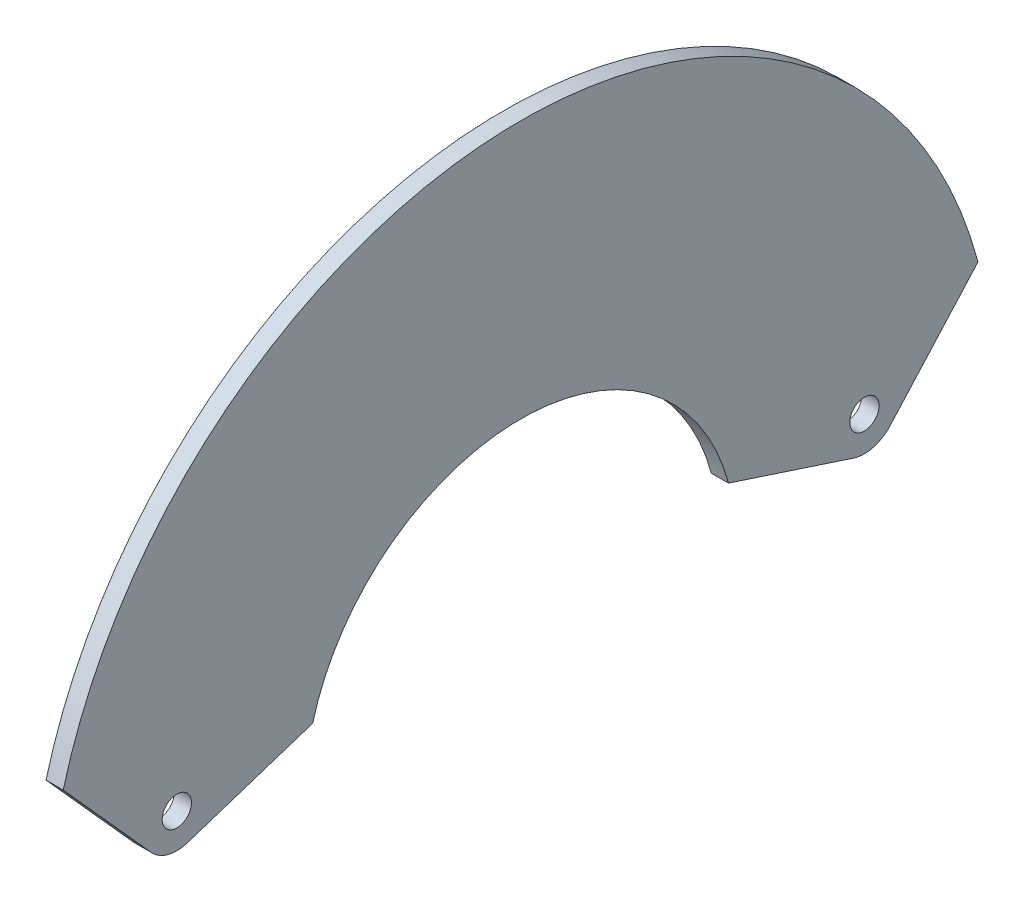
ISO-10303-21;
HEADER;
FILE_DESCRIPTION(('STEP AP214'),'2;1');
FILE_NAME('part.step','',(''),(''),'','','');
FILE_SCHEMA(('AUTOMOTIVE_DESIGN { 1 0 10303 214 1 1 1 1 }'));
ENDSEC;
DATA;
#1=APPLICATION_CONTEXT('core data for automotive mechanical design processes');
#2=APPLICATION_PROTOCOL_DEFINITION('international standard','automotive_design',2000,#1);
#3=PRODUCT_CONTEXT('',#1,'mechanical');
#4=PRODUCT('Part','Part','',(#3));
#5=PRODUCT_RELATED_PRODUCT_CATEGORY('part','',(#4));
#6=PRODUCT_DEFINITION_FORMATION('','',#4);
#7=PRODUCT_DEFINITION_CONTEXT('part definition',#1,'design');
#8=PRODUCT_DEFINITION('design','',#6,#7);
#9=PRODUCT_DEFINITION_SHAPE('','',#8);
#10=(LENGTH_UNIT() NAMED_UNIT(*) SI_UNIT(.MILLI.,.METRE.));
#11=(NAMED_UNIT(*) PLANE_ANGLE_UNIT() SI_UNIT($,.RADIAN.));
#12=(NAMED_UNIT(*) SI_UNIT($,.STERADIAN.) SOLID_ANGLE_UNIT());
#13=UNCERTAINTY_MEASURE_WITH_UNIT(LENGTH_MEASURE(1.E-05),#10,'distance_accuracy_value','');
#14=(GEOMETRIC_REPRESENTATION_CONTEXT(3) GLOBAL_UNCERTAINTY_ASSIGNED_CONTEXT((#13)) GLOBAL_UNIT_ASSIGNED_CONTEXT((#10,
#11,#12)) REPRESENTATION_CONTEXT('',''));
#15=CARTESIAN_POINT('',(0.,0.,0.));
#16=DIRECTION('',(0.,0.,1.));
#17=DIRECTION('',(1.,0.,0.));
#18=AXIS2_PLACEMENT_3D('',#15,#16,#17);
#19=CARTESIAN_POINT('',(-2.,60.,0.));
#20=DIRECTION('',(1.,0.,0.));
#21=DIRECTION('',(0.,0.,-1.));
#22=AXIS2_PLACEMENT_3D('',#19,#20,#21);
#23=CYLINDRICAL_SURFACE('',#22,25.);
#24=CARTESIAN_POINT('',(0.,60.,0.));
#25=DIRECTION('',(1.,0.,0.));
#26=DIRECTION('',(0.,0.,-1.));
#27=AXIS2_PLACEMENT_3D('',#24,#25,#26);
#28=CIRCLE('',#27,25.);
#29=CARTESIAN_POINT('',(0.,66.470476127563,-24.1481456572267));
#30=VERTEX_POINT('',#29);
#31=CARTESIAN_POINT('',(0.,66.470476127563,24.1481456572267));
#32=VERTEX_POINT('',#31);
#33=EDGE_CURVE('E137',#30,#32,#28,.T.);
#34=ORIENTED_EDGE('',*,*,#33,.T.);
#35=DIRECTION('',(1.,0.,0.));
#36=VECTOR('',#35,1.);
#37=CARTESIAN_POINT('',(-2.,66.470476127563,24.1481456572267));
#38=LINE('',#37,#36);
#39=CARTESIAN_POINT('',(-2.,66.470476127563,24.1481456572267));
#40=VERTEX_POINT('',#39);
#41=EDGE_CURVE('E11',#40,#32,#38,.T.);
#42=ORIENTED_EDGE('',*,*,#41,.F.);
#43=CARTESIAN_POINT('',(-2.,60.,0.));
#44=DIRECTION('',(1.,0.,0.));
#45=DIRECTION('',(0.,0.,-1.));
#46=AXIS2_PLACEMENT_3D('',#43,#44,#45);
#47=CIRCLE('',#46,25.);
#48=CARTESIAN_POINT('',(-2.,66.470476127563,-24.1481456572267));
#49=VERTEX_POINT('',#48);
#50=EDGE_CURVE('E54',#49,#40,#47,.T.);
#51=ORIENTED_EDGE('',*,*,#50,.F.);
#52=DIRECTION('',(1.,0.,0.));
#53=VECTOR('',#52,1.);
#54=CARTESIAN_POINT('',(-2.,66.470476127563,-24.1481456572267));
#55=LINE('',#54,#53);
#56=EDGE_CURVE('E39',#49,#30,#55,.T.);
#57=ORIENTED_EDGE('',*,*,#56,.T.);
#58=EDGE_LOOP('',(#34,#42,#51,#57));
#59=FACE_BOUND('',#58,.T.);
#60=ADVANCED_FACE('F36',(#59),#23,.F.);
#61=CARTESIAN_POINT('',(-2.,67.1895641076807,21.9466624955386));
#62=DIRECTION('',(0.,-0.950575341057126,-0.310493995069354));
#63=DIRECTION('',(0.,0.310493995069354,-0.950575341057126));
#64=AXIS2_PLACEMENT_3D('',#61,#62,#63);
#65=PLANE('',#64);
#66=DIRECTION('',(0.,0.310493995069354,-0.950575341057126));
#67=VECTOR('',#66,1.);
#68=CARTESIAN_POINT('',(0.,67.1895641076807,21.9466624955386));
#69=LINE('',#68,#67);
#70=CARTESIAN_POINT('',(0.,61.720831308427,38.6891522967979));
#71=VERTEX_POINT('',#70);
#72=EDGE_CURVE('E152',#71,#32,#69,.T.);
#73=ORIENTED_EDGE('',*,*,#72,.F.);
#74=DIRECTION('',(1.,0.,0.));
#75=VECTOR('',#74,1.);
#76=CARTESIAN_POINT('',(-2.,61.720831308427,38.6891522967979));
#77=LINE('',#76,#75);
#78=CARTESIAN_POINT('',(-2.,61.720831308427,38.6891522967979));
#79=VERTEX_POINT('',#78);
#80=EDGE_CURVE('E45',#79,#71,#77,.T.);
#81=ORIENTED_EDGE('',*,*,#80,.F.);
#82=DIRECTION('',(0.,0.310493995069354,-0.950575341057126));
#83=VECTOR('',#82,1.);
#84=CARTESIAN_POINT('',(-2.,67.1895641076807,21.9466624955386));
#85=LINE('',#84,#83);
#86=EDGE_CURVE('E126',#79,#40,#85,.T.);
#87=ORIENTED_EDGE('',*,*,#86,.T.);
#88=ORIENTED_EDGE('',*,*,#41,.T.);
#89=EDGE_LOOP('',(#73,#81,#87,#88));
#90=FACE_BOUND('',#89,.T.);
#91=ADVANCED_FACE('F178',(#90),#65,.T.);
#92=CARTESIAN_POINT('',(-2.,65.5231326726555,39.9311282770753));
#93=DIRECTION('',(1.,0.,0.));
#94=DIRECTION('',(0.,0.,-1.));
#95=AXIS2_PLACEMENT_3D('',#92,#93,#94);
#96=CYLINDRICAL_SURFACE('',#95,4.00000000000002);
#97=CARTESIAN_POINT('',(0.,65.5231326726555,39.9311282770753));
#98=DIRECTION('',(1.,0.,0.));
#99=DIRECTION('',(0.,0.,-1.));
#100=AXIS2_PLACEMENT_3D('',#97,#98,#99);
#101=CIRCLE('',#100,4.00000000000002);
#102=CARTESIAN_POINT('',(0.,62.8512310885281,42.9078617089999));
#103=VERTEX_POINT('',#102);
#104=EDGE_CURVE('E111',#103,#71,#101,.T.);
#105=ORIENTED_EDGE('',*,*,#104,.F.);
#106=DIRECTION('',(1.,0.,0.));
#107=VECTOR('',#106,1.);
#108=CARTESIAN_POINT('',(-2.,62.8512310885281,42.9078617089999));
#109=LINE('',#108,#107);
#110=CARTESIAN_POINT('',(-2.,62.8512310885281,42.9078617089999));
#111=VERTEX_POINT('',#110);
#112=EDGE_CURVE('E106',#111,#103,#109,.T.);
#113=ORIENTED_EDGE('',*,*,#112,.F.);
#114=CARTESIAN_POINT('',(-2.,65.5231326726555,39.9311282770753));
#115=DIRECTION('',(1.,0.,0.));
#116=DIRECTION('',(0.,0.,-1.));
#117=AXIS2_PLACEMENT_3D('',#114,#115,#116);
#118=CIRCLE('',#117,4.00000000000002);
#119=EDGE_CURVE('E110',#111,#79,#118,.T.);
#120=ORIENTED_EDGE('',*,*,#119,.T.);
#121=ORIENTED_EDGE('',*,*,#80,.T.);
#122=EDGE_LOOP('',(#105,#113,#120,#121));
#123=FACE_BOUND('',#122,.T.);
#124=ADVANCED_FACE('F108',(#123),#96,.T.);
#125=CARTESIAN_POINT('',(-2.,6.71432794402526,-7.48035203939323));
#126=DIRECTION('',(0.,0.667975396031851,-0.744183357981145));
#127=DIRECTION('',(0.,0.744183357981145,0.667975396031851));
#128=AXIS2_PLACEMENT_3D('',#125,#126,#127);
#129=PLANE('',#128);
#130=DIRECTION('',(0.,0.744183357981145,0.667975396031851));
#131=VECTOR('',#130,1.);
#132=CARTESIAN_POINT('',(0.,6.71432794402526,-7.48035203939323));
#133=LINE('',#132,#131);
#134=CARTESIAN_POINT('',(0.,74.2350474806387,53.1259204458988));
#135=VERTEX_POINT('',#134);
#136=EDGE_CURVE('E149',#103,#135,#133,.T.);
#137=ORIENTED_EDGE('',*,*,#136,.T.);
#138=DIRECTION('',(1.,0.,0.));
#139=VECTOR('',#138,1.);
#140=CARTESIAN_POINT('',(-2.,74.2350474806387,53.1259204458988));
#141=LINE('',#140,#139);
#142=CARTESIAN_POINT('',(-2.,74.2350474806387,53.1259204458988));
#143=VERTEX_POINT('',#142);
#144=EDGE_CURVE('E115',#143,#135,#141,.T.);
#145=ORIENTED_EDGE('',*,*,#144,.F.);
#146=DIRECTION('',(0.,0.744183357981145,0.667975396031851));
#147=VECTOR('',#146,1.);
#148=CARTESIAN_POINT('',(-2.,6.71432794402526,-7.48035203939323));
#149=LINE('',#148,#147);
#150=EDGE_CURVE('E118',#111,#143,#149,.T.);
#151=ORIENTED_EDGE('',*,*,#150,.F.);
#152=ORIENTED_EDGE('',*,*,#112,.T.);
#153=EDGE_LOOP('',(#137,#145,#151,#152));
#154=FACE_BOUND('',#153,.T.);
#155=ADVANCED_FACE('F119',(#154),#129,.F.);
#156=CARTESIAN_POINT('',(-2.,60.,0.));
#157=DIRECTION('',(1.,0.,0.));
#158=DIRECTION('',(0.,0.,-1.));
#159=AXIS2_PLACEMENT_3D('',#156,#157,#158);
#160=CYLINDRICAL_SURFACE('',#159,55.);
#161=CARTESIAN_POINT('',(0.,60.,0.));
#162=DIRECTION('',(1.,0.,0.));
#163=DIRECTION('',(0.,0.,-1.));
#164=AXIS2_PLACEMENT_3D('',#161,#162,#163);
#165=CIRCLE('',#164,55.);
#166=CARTESIAN_POINT('',(0.,74.2350474806386,-53.1259204458987));
#167=VERTEX_POINT('',#166);
#168=EDGE_CURVE('E146',#167,#135,#165,.T.);
#169=ORIENTED_EDGE('',*,*,#168,.F.);
#170=DIRECTION('',(1.,0.,0.));
#171=VECTOR('',#170,1.);
#172=CARTESIAN_POINT('',(-2.,74.2350474806386,-53.1259204458987));
#173=LINE('',#172,#171);
#174=CARTESIAN_POINT('',(-2.,74.2350474806386,-53.1259204458987));
#175=VERTEX_POINT('',#174);
#176=EDGE_CURVE('E163',#175,#167,#173,.T.);
#177=ORIENTED_EDGE('',*,*,#176,.F.);
#178=CARTESIAN_POINT('',(-2.,60.,0.));
#179=DIRECTION('',(1.,0.,0.));
#180=DIRECTION('',(0.,0.,-1.));
#181=AXIS2_PLACEMENT_3D('',#178,#179,#180);
#182=CIRCLE('',#181,55.);
#183=EDGE_CURVE('E122',#175,#143,#182,.T.);
#184=ORIENTED_EDGE('',*,*,#183,.T.);
#185=ORIENTED_EDGE('',*,*,#144,.T.);
#186=EDGE_LOOP('',(#169,#177,#184,#185));
#187=FACE_BOUND('',#186,.T.);
#188=ADVANCED_FACE('F192',(#187),#160,.T.);
#189=CARTESIAN_POINT('',(-2.,6.71432794402524,7.48035203939321));
#190=DIRECTION('',(0.,-0.66797539603185,-0.744183357981145));
#191=DIRECTION('',(0.,0.744183357981145,-0.66797539603185));
#192=AXIS2_PLACEMENT_3D('',#189,#190,#191);
#193=PLANE('',#192);
#194=DIRECTION('',(0.,0.744183357981145,-0.66797539603185));
#195=VECTOR('',#194,1.);
#196=CARTESIAN_POINT('',(0.,6.71432794402524,7.48035203939321));
#197=LINE('',#196,#195);
#198=CARTESIAN_POINT('',(0.,62.8512310885281,-42.9078617089999));
#199=VERTEX_POINT('',#198);
#200=EDGE_CURVE('E143',#199,#167,#197,.T.);
#201=ORIENTED_EDGE('',*,*,#200,.F.);
#202=DIRECTION('',(1.,0.,0.));
#203=VECTOR('',#202,1.);
#204=CARTESIAN_POINT('',(-2.,62.8512310885281,-42.9078617089999));
#205=LINE('',#204,#203);
#206=CARTESIAN_POINT('',(-2.,62.8512310885281,-42.9078617089999));
#207=VERTEX_POINT('',#206);
#208=EDGE_CURVE('E165',#207,#199,#205,.T.);
#209=ORIENTED_EDGE('',*,*,#208,.F.);
#210=DIRECTION('',(0.,0.744183357981145,-0.66797539603185));
#211=VECTOR('',#210,1.);
#212=CARTESIAN_POINT('',(-2.,6.71432794402524,7.48035203939321));
#213=LINE('',#212,#211);
#214=EDGE_CURVE('E309',#207,#175,#213,.T.);
#215=ORIENTED_EDGE('',*,*,#214,.T.);
#216=ORIENTED_EDGE('',*,*,#176,.T.);
#217=EDGE_LOOP('',(#201,#209,#215,#216));
#218=FACE_BOUND('',#217,.T.);
#219=ADVANCED_FACE('F195',(#218),#193,.T.);
#220=CARTESIAN_POINT('',(-2.,65.5231326726555,-39.9311282770753));
#221=DIRECTION('',(1.,0.,0.));
#222=DIRECTION('',(0.,0.,-1.));
#223=AXIS2_PLACEMENT_3D('',#220,#221,#222);
#224=CYLINDRICAL_SURFACE('',#223,4.00000000000002);
#225=CARTESIAN_POINT('',(0.,65.5231326726555,-39.9311282770753));
#226=DIRECTION('',(1.,0.,0.));
#227=DIRECTION('',(0.,0.,-1.));
#228=AXIS2_PLACEMENT_3D('',#225,#226,#227);
#229=CIRCLE('',#228,4.00000000000002);
#230=CARTESIAN_POINT('',(0.,61.720831308427,-38.6891522967979));
#231=VERTEX_POINT('',#230);
#232=EDGE_CURVE('E141',#199,#231,#229,.F.);
#233=ORIENTED_EDGE('',*,*,#232,.T.);
#234=DIRECTION('',(1.,0.,0.));
#235=VECTOR('',#234,1.);
#236=CARTESIAN_POINT('',(-2.,61.720831308427,-38.6891522967979));
#237=LINE('',#236,#235);
#238=CARTESIAN_POINT('',(-2.,61.720831308427,-38.6891522967979));
#239=VERTEX_POINT('',#238);
#240=EDGE_CURVE('E166',#239,#231,#237,.T.);
#241=ORIENTED_EDGE('',*,*,#240,.F.);
#242=CARTESIAN_POINT('',(-2.,65.5231326726555,-39.9311282770753));
#243=DIRECTION('',(1.,0.,0.));
#244=DIRECTION('',(0.,0.,-1.));
#245=AXIS2_PLACEMENT_3D('',#242,#243,#244);
#246=CIRCLE('',#245,4.00000000000002);
#247=EDGE_CURVE('E310',#207,#239,#246,.F.);
#248=ORIENTED_EDGE('',*,*,#247,.F.);
#249=ORIENTED_EDGE('',*,*,#208,.T.);
#250=EDGE_LOOP('',(#233,#241,#248,#249));
#251=FACE_BOUND('',#250,.T.);
#252=ADVANCED_FACE('F199',(#251),#224,.T.);
#253=CARTESIAN_POINT('',(-2.,65.5231326726555,39.9311282770753));
#254=DIRECTION('',(1.,0.,0.));
#255=DIRECTION('',(0.,0.,-1.));
#256=AXIS2_PLACEMENT_3D('',#253,#254,#255);
#257=CYLINDRICAL_SURFACE('',#256,1.7);
#258=CARTESIAN_POINT('',(-2.,65.5231326726555,39.9311282770753));
#259=DIRECTION('',(1.,0.,0.));
#260=DIRECTION('',(0.,0.,-1.));
#261=AXIS2_PLACEMENT_3D('',#258,#259,#260);
#262=CIRCLE('',#261,1.7);
#263=CARTESIAN_POINT('',(-2.,65.5231326726555,38.2311282770753));
#264=VERTEX_POINT('',#263);
#265=EDGE_CURVE('E128',#264,#264,#262,.T.);
#266=ORIENTED_EDGE('',*,*,#265,.F.);
#267=EDGE_LOOP('',(#266));
#268=FACE_BOUND('',#267,.T.);
#269=CARTESIAN_POINT('',(0.,65.5231326726555,39.9311282770753));
#270=DIRECTION('',(1.,0.,0.));
#271=DIRECTION('',(0.,0.,-1.));
#272=AXIS2_PLACEMENT_3D('',#269,#270,#271);
#273=CIRCLE('',#272,1.7);
#274=CARTESIAN_POINT('',(0.,65.5231326726555,38.2311282770753));
#275=VERTEX_POINT('',#274);
#276=EDGE_CURVE('E155',#275,#275,#273,.T.);
#277=ORIENTED_EDGE('',*,*,#276,.T.);
#278=EDGE_LOOP('',(#277));
#279=FACE_BOUND('',#278,.T.);
#280=ADVANCED_FACE('F187',(#268,#279),#257,.F.);
#281=CARTESIAN_POINT('',(-2.,67.1895641076807,-21.9466624955386));
#282=DIRECTION('',(0.,0.950575341057126,-0.310493995069354));
#283=DIRECTION('',(0.,0.310493995069354,0.950575341057126));
#284=AXIS2_PLACEMENT_3D('',#281,#282,#283);
#285=PLANE('',#284);
#286=DIRECTION('',(0.,0.310493995069354,0.950575341057126));
#287=VECTOR('',#286,1.);
#288=CARTESIAN_POINT('',(0.,67.1895641076807,-21.9466624955386));
#289=LINE('',#288,#287);
#290=EDGE_CURVE('E139',#231,#30,#289,.T.);
#291=ORIENTED_EDGE('',*,*,#290,.T.);
#292=ORIENTED_EDGE('',*,*,#56,.F.);
#293=DIRECTION('',(0.,0.310493995069354,0.950575341057126));
#294=VECTOR('',#293,1.);
#295=CARTESIAN_POINT('',(-2.,67.1895641076807,-21.9466624955386));
#296=LINE('',#295,#294);
#297=EDGE_CURVE('E93',#239,#49,#296,.T.);
#298=ORIENTED_EDGE('',*,*,#297,.F.);
#299=ORIENTED_EDGE('',*,*,#240,.T.);
#300=EDGE_LOOP('',(#291,#292,#298,#299));
#301=FACE_BOUND('',#300,.T.);
#302=ADVANCED_FACE('F203',(#301),#285,.F.);
#303=CARTESIAN_POINT('',(-2.,65.5231326726555,-39.9311282770753));
#304=DIRECTION('',(1.,0.,0.));
#305=DIRECTION('',(0.,0.,-1.));
#306=AXIS2_PLACEMENT_3D('',#303,#304,#305);
#307=CYLINDRICAL_SURFACE('',#306,1.7);
#308=CARTESIAN_POINT('',(-2.,65.5231326726555,-39.9311282770753));
#309=DIRECTION('',(1.,0.,0.));
#310=DIRECTION('',(0.,0.,-1.));
#311=AXIS2_PLACEMENT_3D('',#308,#309,#310);
#312=CIRCLE('',#311,1.7);
#313=CARTESIAN_POINT('',(-2.,65.5231326726555,-41.6311282770753));
#314=VERTEX_POINT('',#313);
#315=EDGE_CURVE('E134',#314,#314,#312,.T.);
#316=ORIENTED_EDGE('',*,*,#315,.F.);
#317=EDGE_LOOP('',(#316));
#318=FACE_BOUND('',#317,.T.);
#319=CARTESIAN_POINT('',(0.,65.5231326726555,-39.9311282770753));
#320=DIRECTION('',(1.,0.,0.));
#321=DIRECTION('',(0.,0.,-1.));
#322=AXIS2_PLACEMENT_3D('',#319,#320,#321);
#323=CIRCLE('',#322,1.7);
#324=CARTESIAN_POINT('',(0.,65.5231326726555,-41.6311282770753));
#325=VERTEX_POINT('',#324);
#326=EDGE_CURVE('E158',#325,#325,#323,.T.);
#327=ORIENTED_EDGE('',*,*,#326,.T.);
#328=EDGE_LOOP('',(#327));
#329=FACE_BOUND('',#328,.T.);
#330=ADVANCED_FACE('F205',(#318,#329),#307,.F.);
#331=CARTESIAN_POINT('',(-2.,0.,0.));
#332=DIRECTION('',(1.,0.,0.));
#333=DIRECTION('',(0.,0.,-1.));
#334=AXIS2_PLACEMENT_3D('',#331,#332,#333);
#335=PLANE('',#334);
#336=ORIENTED_EDGE('',*,*,#50,.T.);
#337=ORIENTED_EDGE('',*,*,#86,.F.);
#338=ORIENTED_EDGE('',*,*,#119,.F.);
#339=ORIENTED_EDGE('',*,*,#150,.T.);
#340=ORIENTED_EDGE('',*,*,#183,.F.);
#341=ORIENTED_EDGE('',*,*,#214,.F.);
#342=ORIENTED_EDGE('',*,*,#247,.T.);
#343=ORIENTED_EDGE('',*,*,#297,.T.);
#344=EDGE_LOOP('',(#336,#337,#338,#339,#340,#341,#342,#343));
#345=FACE_BOUND('',#344,.T.);
#346=ORIENTED_EDGE('',*,*,#265,.T.);
#347=EDGE_LOOP('',(#346));
#348=FACE_BOUND('',#347,.T.);
#349=ORIENTED_EDGE('',*,*,#315,.T.);
#350=EDGE_LOOP('',(#349));
#351=FACE_BOUND('',#350,.T.);
#352=ADVANCED_FACE('F124',(#345,#348,#351),#335,.F.);
#353=CARTESIAN_POINT('',(0.,0.,0.));
#354=DIRECTION('',(1.,0.,0.));
#355=DIRECTION('',(0.,0.,-1.));
#356=AXIS2_PLACEMENT_3D('',#353,#354,#355);
#357=PLANE('',#356);
#358=ORIENTED_EDGE('',*,*,#33,.F.);
#359=ORIENTED_EDGE('',*,*,#290,.F.);
#360=ORIENTED_EDGE('',*,*,#232,.F.);
#361=ORIENTED_EDGE('',*,*,#200,.T.);
#362=ORIENTED_EDGE('',*,*,#168,.T.);
#363=ORIENTED_EDGE('',*,*,#136,.F.);
#364=ORIENTED_EDGE('',*,*,#104,.T.);
#365=ORIENTED_EDGE('',*,*,#72,.T.);
#366=EDGE_LOOP('',(#358,#359,#360,#361,#362,#363,#364,#365));
#367=FACE_BOUND('',#366,.T.);
#368=ORIENTED_EDGE('',*,*,#276,.F.);
#369=EDGE_LOOP('',(#368));
#370=FACE_BOUND('',#369,.T.);
#371=ORIENTED_EDGE('',*,*,#326,.F.);
#372=EDGE_LOOP('',(#371));
#373=FACE_BOUND('',#372,.T.);
#374=ADVANCED_FACE('F175',(#367,#370,#373),#357,.T.);
#375=CLOSED_SHELL('',(#60,#91,#124,#155,#188,#219,#252,#280,#302,#330,#352,#374));
#376=MANIFOLD_SOLID_BREP('B2',#375);
#377=ADVANCED_BREP_SHAPE_REPRESENTATION('',(#18,#376),#14);
#378=SHAPE_DEFINITION_REPRESENTATION(#9,#377);
ENDSEC;
END-ISO-10303-21;
